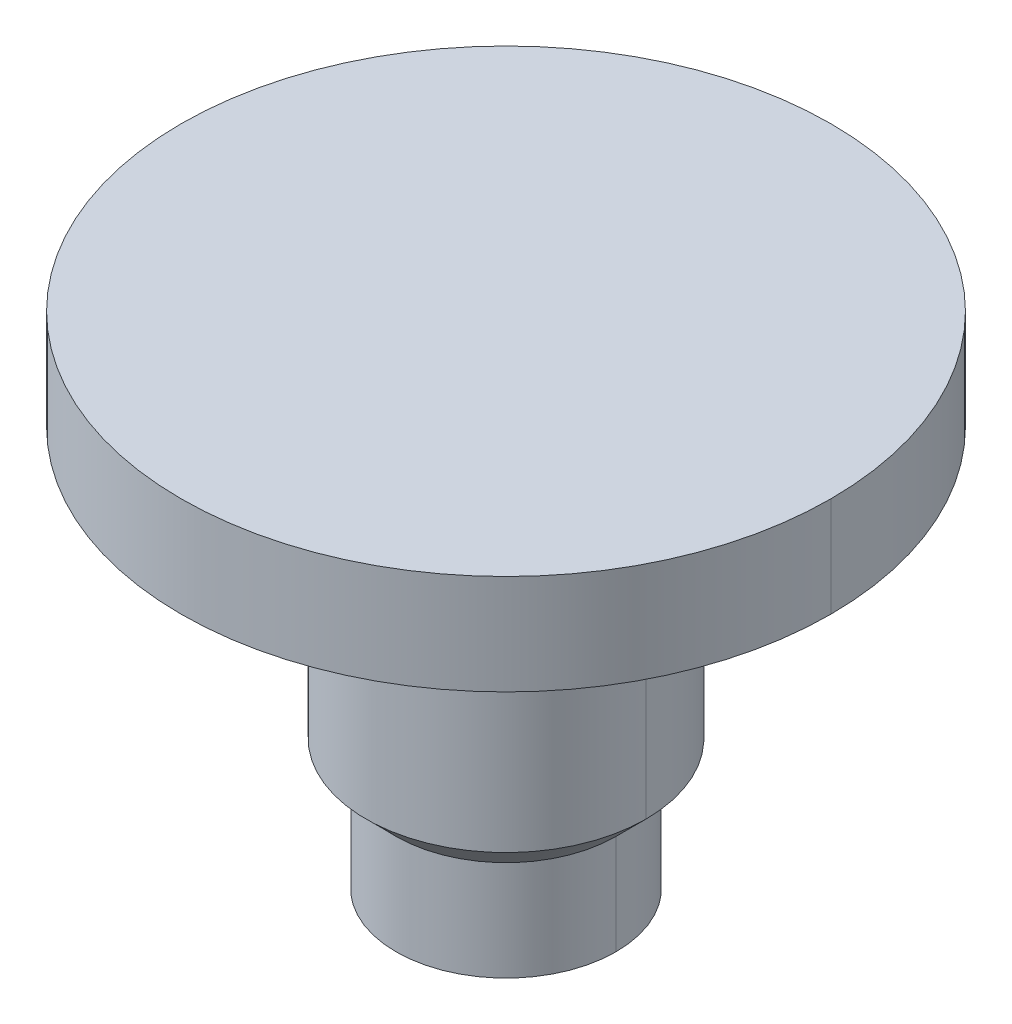
ISO-10303-21;
HEADER;
FILE_DESCRIPTION(('STEP AP214'),'2;1');
FILE_NAME('part.step','',(''),(''),'','','');
FILE_SCHEMA(('AUTOMOTIVE_DESIGN { 1 0 10303 214 1 1 1 1 }'));
ENDSEC;
DATA;
#1=APPLICATION_CONTEXT('core data for automotive mechanical design processes');
#2=APPLICATION_PROTOCOL_DEFINITION('international standard','automotive_design',2000,#1);
#3=PRODUCT_CONTEXT('',#1,'mechanical');
#4=PRODUCT('Part','Part','',(#3));
#5=PRODUCT_RELATED_PRODUCT_CATEGORY('part','',(#4));
#6=PRODUCT_DEFINITION_FORMATION('','',#4);
#7=PRODUCT_DEFINITION_CONTEXT('part definition',#1,'design');
#8=PRODUCT_DEFINITION('design','',#6,#7);
#9=PRODUCT_DEFINITION_SHAPE('','',#8);
#10=(LENGTH_UNIT() NAMED_UNIT(*) SI_UNIT(.MILLI.,.METRE.));
#11=(NAMED_UNIT(*) PLANE_ANGLE_UNIT() SI_UNIT($,.RADIAN.));
#12=(NAMED_UNIT(*) SI_UNIT($,.STERADIAN.) SOLID_ANGLE_UNIT());
#13=UNCERTAINTY_MEASURE_WITH_UNIT(LENGTH_MEASURE(1.E-05),#10,'distance_accuracy_value','');
#14=(GEOMETRIC_REPRESENTATION_CONTEXT(3) GLOBAL_UNCERTAINTY_ASSIGNED_CONTEXT((#13)) GLOBAL_UNIT_ASSIGNED_CONTEXT((#10,
#11,#12)) REPRESENTATION_CONTEXT('',''));
#15=CARTESIAN_POINT('',(0.,0.,0.));
#16=DIRECTION('',(0.,0.,1.));
#17=DIRECTION('',(1.,0.,0.));
#18=AXIS2_PLACEMENT_3D('',#15,#16,#17);
#19=CARTESIAN_POINT('',(0.,0.,0.));
#20=DIRECTION('',(0.,1.,0.));
#21=DIRECTION('',(0.,0.,1.));
#22=AXIS2_PLACEMENT_3D('',#19,#20,#21);
#23=PLANE('',#22);
#24=CARTESIAN_POINT('',(0.,0.,0.));
#25=DIRECTION('',(0.,-1.,0.));
#26=DIRECTION('',(0.,0.,-1.));
#27=AXIS2_PLACEMENT_3D('',#24,#25,#26);
#28=CIRCLE('',#27,1.1);
#29=CARTESIAN_POINT('',(-1.1,0.,0.));
#30=VERTEX_POINT('',#29);
#31=CARTESIAN_POINT('',(1.1,0.,0.));
#32=VERTEX_POINT('',#31);
#33=EDGE_CURVE('E121',#30,#32,#28,.F.);
#34=ORIENTED_EDGE('',*,*,#33,.F.);
#35=CARTESIAN_POINT('',(0.,0.,0.));
#36=DIRECTION('',(0.,-1.,0.));
#37=DIRECTION('',(0.,0.,-1.));
#38=AXIS2_PLACEMENT_3D('',#35,#36,#37);
#39=CIRCLE('',#38,1.1);
#40=EDGE_CURVE('E20',#32,#30,#39,.F.);
#41=ORIENTED_EDGE('',*,*,#40,.F.);
#42=EDGE_LOOP('',(#34,#41));
#43=FACE_BOUND('',#42,.T.);
#44=ADVANCED_FACE('F17',(#43),#23,.F.);
#45=CARTESIAN_POINT('',(0.,0.,0.));
#46=DIRECTION('',(0.,-1.,0.));
#47=DIRECTION('',(0.,0.,-1.));
#48=AXIS2_PLACEMENT_3D('',#45,#46,#47);
#49=CYLINDRICAL_SURFACE('',#48,1.1);
#50=DIRECTION('',(0.,-1.,0.));
#51=VECTOR('',#50,1.);
#52=CARTESIAN_POINT('',(1.1,0.,0.));
#53=LINE('',#52,#51);
#54=CARTESIAN_POINT('',(1.09999999999186,0.999999999995301,0.));
#55=VERTEX_POINT('',#54);
#56=EDGE_CURVE('E67',#32,#55,#53,.F.);
#57=ORIENTED_EDGE('',*,*,#56,.F.);
#58=ORIENTED_EDGE('',*,*,#40,.T.);
#59=DIRECTION('',(0.,-1.,0.));
#60=VECTOR('',#59,1.);
#61=CARTESIAN_POINT('',(-1.1,0.,0.));
#62=LINE('',#61,#60);
#63=CARTESIAN_POINT('',(-1.09999999999186,0.999999999976353,0.));
#64=VERTEX_POINT('',#63);
#65=EDGE_CURVE('E124',#64,#30,#62,.T.);
#66=ORIENTED_EDGE('',*,*,#65,.F.);
#67=CARTESIAN_POINT('',(0.,1.0000000000332,0.));
#68=DIRECTION('',(0.,1.,0.));
#69=DIRECTION('',(-1.,0.,0.));
#70=AXIS2_PLACEMENT_3D('',#67,#68,#69);
#71=CIRCLE('',#70,1.10000000000809);
#72=EDGE_CURVE('E103',#55,#64,#71,.T.);
#73=ORIENTED_EDGE('',*,*,#72,.F.);
#74=EDGE_LOOP('',(#57,#58,#66,#73));
#75=FACE_BOUND('',#74,.T.);
#76=ADVANCED_FACE('F142',(#75),#49,.T.);
#77=CARTESIAN_POINT('',(0.,0.,0.));
#78=DIRECTION('',(0.,-1.,0.));
#79=DIRECTION('',(0.,0.,-1.));
#80=AXIS2_PLACEMENT_3D('',#77,#78,#79);
#81=CYLINDRICAL_SURFACE('',#80,1.1);
#82=ORIENTED_EDGE('',*,*,#65,.T.);
#83=ORIENTED_EDGE('',*,*,#33,.T.);
#84=ORIENTED_EDGE('',*,*,#56,.T.);
#85=CARTESIAN_POINT('',(0.,1.0000000000332,0.));
#86=DIRECTION('',(0.,1.,0.));
#87=DIRECTION('',(-1.,0.,0.));
#88=AXIS2_PLACEMENT_3D('',#85,#86,#87);
#89=CIRCLE('',#88,1.10000000000809);
#90=EDGE_CURVE('E91',#64,#55,#89,.T.);
#91=ORIENTED_EDGE('',*,*,#90,.F.);
#92=EDGE_LOOP('',(#82,#83,#84,#91));
#93=FACE_BOUND('',#92,.T.);
#94=ADVANCED_FACE('F141',(#93),#81,.T.);
#95=CARTESIAN_POINT('',(0.,1.29999999990105,0.));
#96=DIRECTION('',(0.,1.,0.));
#97=DIRECTION('',(0.,0.,1.));
#98=AXIS2_PLACEMENT_3D('',#95,#96,#97);
#99=CONICAL_SURFACE('',#98,1.39999999987594,0.78539816330271);
#100=DIRECTION('',(-0.707106781186443,-0.707106781186652,0.));
#101=VECTOR('',#100,1.);
#102=CARTESIAN_POINT('',(499000.,498999.900000148,6.11078570557366E-11));
#103=LINE('',#102,#101);
#104=CARTESIAN_POINT('',(1.39999999996899,1.29999999997526,0.));
#105=VERTEX_POINT('',#104);
#106=EDGE_CURVE('E106',#55,#105,#103,.F.);
#107=ORIENTED_EDGE('',*,*,#106,.F.);
#108=ORIENTED_EDGE('',*,*,#72,.T.);
#109=DIRECTION('',(0.707106781186443,-0.707106781186652,0.));
#110=VECTOR('',#109,1.);
#111=CARTESIAN_POINT('',(-499000.,498999.900000148,0.));
#112=LINE('',#111,#110);
#113=CARTESIAN_POINT('',(-1.39999999996899,1.29999999997526,0.));
#114=VERTEX_POINT('',#113);
#115=EDGE_CURVE('E101',#114,#64,#112,.T.);
#116=ORIENTED_EDGE('',*,*,#115,.F.);
#117=CARTESIAN_POINT('',(0.,1.3,0.));
#118=DIRECTION('',(0.,-1.,0.));
#119=DIRECTION('',(0.,0.,-1.));
#120=AXIS2_PLACEMENT_3D('',#117,#118,#119);
#121=CIRCLE('',#120,1.4);
#122=EDGE_CURVE('E80',#105,#114,#121,.F.);
#123=ORIENTED_EDGE('',*,*,#122,.F.);
#124=EDGE_LOOP('',(#107,#108,#116,#123));
#125=FACE_BOUND('',#124,.T.);
#126=ADVANCED_FACE('F102',(#125),#99,.T.);
#127=CARTESIAN_POINT('',(0.,1.29999999990105,0.));
#128=DIRECTION('',(0.,1.,0.));
#129=DIRECTION('',(0.,0.,1.));
#130=AXIS2_PLACEMENT_3D('',#127,#128,#129);
#131=CONICAL_SURFACE('',#130,1.39999999987594,0.78539816330271);
#132=ORIENTED_EDGE('',*,*,#115,.T.);
#133=ORIENTED_EDGE('',*,*,#90,.T.);
#134=ORIENTED_EDGE('',*,*,#106,.T.);
#135=CARTESIAN_POINT('',(0.,1.3,0.));
#136=DIRECTION('',(0.,-1.,0.));
#137=DIRECTION('',(0.,0.,-1.));
#138=AXIS2_PLACEMENT_3D('',#135,#136,#137);
#139=CIRCLE('',#138,1.4);
#140=EDGE_CURVE('E96',#114,#105,#139,.F.);
#141=ORIENTED_EDGE('',*,*,#140,.F.);
#142=EDGE_LOOP('',(#132,#133,#134,#141));
#143=FACE_BOUND('',#142,.T.);
#144=ADVANCED_FACE('F108',(#143),#131,.T.);
#145=CARTESIAN_POINT('',(0.,0.,0.));
#146=DIRECTION('',(0.,-1.,0.));
#147=DIRECTION('',(0.,0.,-1.));
#148=AXIS2_PLACEMENT_3D('',#145,#146,#147);
#149=CYLINDRICAL_SURFACE('',#148,1.4);
#150=DIRECTION('',(0.,-1.,0.));
#151=VECTOR('',#150,1.);
#152=CARTESIAN_POINT('',(1.4,0.,0.));
#153=LINE('',#152,#151);
#154=CARTESIAN_POINT('',(1.4,4.,0.));
#155=VERTEX_POINT('',#154);
#156=EDGE_CURVE('E86',#105,#155,#153,.F.);
#157=ORIENTED_EDGE('',*,*,#156,.F.);
#158=ORIENTED_EDGE('',*,*,#122,.T.);
#159=DIRECTION('',(0.,-1.,0.));
#160=VECTOR('',#159,1.);
#161=CARTESIAN_POINT('',(-1.4,0.,0.));
#162=LINE('',#161,#160);
#163=CARTESIAN_POINT('',(-1.4,4.,0.));
#164=VERTEX_POINT('',#163);
#165=EDGE_CURVE('E84',#164,#114,#162,.T.);
#166=ORIENTED_EDGE('',*,*,#165,.F.);
#167=CARTESIAN_POINT('',(0.,4.,0.));
#168=DIRECTION('',(0.,-1.,0.));
#169=DIRECTION('',(0.,0.,-1.));
#170=AXIS2_PLACEMENT_3D('',#167,#168,#169);
#171=CIRCLE('',#170,1.4);
#172=EDGE_CURVE('E109',#164,#155,#171,.T.);
#173=ORIENTED_EDGE('',*,*,#172,.T.);
#174=EDGE_LOOP('',(#157,#158,#166,#173));
#175=FACE_BOUND('',#174,.T.);
#176=ADVANCED_FACE('F82',(#175),#149,.T.);
#177=CARTESIAN_POINT('',(0.,0.,0.));
#178=DIRECTION('',(0.,-1.,0.));
#179=DIRECTION('',(0.,0.,-1.));
#180=AXIS2_PLACEMENT_3D('',#177,#178,#179);
#181=CYLINDRICAL_SURFACE('',#180,1.4);
#182=ORIENTED_EDGE('',*,*,#165,.T.);
#183=ORIENTED_EDGE('',*,*,#140,.T.);
#184=ORIENTED_EDGE('',*,*,#156,.T.);
#185=CARTESIAN_POINT('',(0.,4.,0.));
#186=DIRECTION('',(0.,-1.,0.));
#187=DIRECTION('',(0.,0.,-1.));
#188=AXIS2_PLACEMENT_3D('',#185,#186,#187);
#189=CIRCLE('',#188,1.4);
#190=EDGE_CURVE('E98',#155,#164,#189,.T.);
#191=ORIENTED_EDGE('',*,*,#190,.T.);
#192=EDGE_LOOP('',(#182,#183,#184,#191));
#193=FACE_BOUND('',#192,.T.);
#194=ADVANCED_FACE('F94',(#193),#181,.T.);
#195=CARTESIAN_POINT('',(-1.4,4.,0.));
#196=DIRECTION('',(0.,1.,0.));
#197=DIRECTION('',(0.,0.,1.));
#198=AXIS2_PLACEMENT_3D('',#195,#196,#197);
#199=PLANE('',#198);
#200=ORIENTED_EDGE('',*,*,#172,.F.);
#201=ORIENTED_EDGE('',*,*,#190,.F.);
#202=EDGE_LOOP('',(#200,#201));
#203=FACE_BOUND('',#202,.T.);
#204=CARTESIAN_POINT('',(0.,4.,0.));
#205=DIRECTION('',(0.,-1.,0.));
#206=DIRECTION('',(0.,0.,-1.));
#207=AXIS2_PLACEMENT_3D('',#204,#205,#206);
#208=CIRCLE('',#207,3.25);
#209=CARTESIAN_POINT('',(-3.25,4.,0.));
#210=VERTEX_POINT('',#209);
#211=CARTESIAN_POINT('',(3.25,4.,0.));
#212=VERTEX_POINT('',#211);
#213=EDGE_CURVE('E136',#210,#212,#208,.F.);
#214=ORIENTED_EDGE('',*,*,#213,.F.);
#215=CARTESIAN_POINT('',(0.,4.,0.));
#216=DIRECTION('',(0.,-1.,0.));
#217=DIRECTION('',(0.,0.,-1.));
#218=AXIS2_PLACEMENT_3D('',#215,#216,#217);
#219=CIRCLE('',#218,3.25);
#220=EDGE_CURVE('E139',#212,#210,#219,.F.);
#221=ORIENTED_EDGE('',*,*,#220,.F.);
#222=EDGE_LOOP('',(#214,#221));
#223=FACE_BOUND('',#222,.T.);
#224=ADVANCED_FACE('F163',(#203,#223),#199,.F.);
#225=CARTESIAN_POINT('',(0.,0.,0.));
#226=DIRECTION('',(0.,-1.,0.));
#227=DIRECTION('',(0.,0.,-1.));
#228=AXIS2_PLACEMENT_3D('',#225,#226,#227);
#229=CYLINDRICAL_SURFACE('',#228,3.25);
#230=DIRECTION('',(0.,-1.,0.));
#231=VECTOR('',#230,1.);
#232=CARTESIAN_POINT('',(3.25,0.,0.));
#233=LINE('',#232,#231);
#234=CARTESIAN_POINT('',(3.25,5.,0.));
#235=VERTEX_POINT('',#234);
#236=EDGE_CURVE('E34',#212,#235,#233,.F.);
#237=ORIENTED_EDGE('',*,*,#236,.F.);
#238=ORIENTED_EDGE('',*,*,#220,.T.);
#239=DIRECTION('',(0.,-1.,0.));
#240=VECTOR('',#239,1.);
#241=CARTESIAN_POINT('',(-3.25,0.,0.));
#242=LINE('',#241,#240);
#243=CARTESIAN_POINT('',(-3.25,5.,0.));
#244=VERTEX_POINT('',#243);
#245=EDGE_CURVE('E138',#244,#210,#242,.T.);
#246=ORIENTED_EDGE('',*,*,#245,.F.);
#247=CARTESIAN_POINT('',(0.,5.,0.));
#248=DIRECTION('',(0.,-1.,0.));
#249=DIRECTION('',(0.,0.,-1.));
#250=AXIS2_PLACEMENT_3D('',#247,#248,#249);
#251=CIRCLE('',#250,3.25);
#252=EDGE_CURVE('E26',#244,#235,#251,.T.);
#253=ORIENTED_EDGE('',*,*,#252,.T.);
#254=EDGE_LOOP('',(#237,#238,#246,#253));
#255=FACE_BOUND('',#254,.T.);
#256=ADVANCED_FACE('F158',(#255),#229,.T.);
#257=CARTESIAN_POINT('',(0.,0.,0.));
#258=DIRECTION('',(0.,-1.,0.));
#259=DIRECTION('',(0.,0.,-1.));
#260=AXIS2_PLACEMENT_3D('',#257,#258,#259);
#261=CYLINDRICAL_SURFACE('',#260,3.25);
#262=ORIENTED_EDGE('',*,*,#245,.T.);
#263=ORIENTED_EDGE('',*,*,#213,.T.);
#264=ORIENTED_EDGE('',*,*,#236,.T.);
#265=CARTESIAN_POINT('',(0.,5.,0.));
#266=DIRECTION('',(0.,-1.,0.));
#267=DIRECTION('',(0.,0.,-1.));
#268=AXIS2_PLACEMENT_3D('',#265,#266,#267);
#269=CIRCLE('',#268,3.25);
#270=EDGE_CURVE('E11',#235,#244,#269,.T.);
#271=ORIENTED_EDGE('',*,*,#270,.T.);
#272=EDGE_LOOP('',(#262,#263,#264,#271));
#273=FACE_BOUND('',#272,.T.);
#274=ADVANCED_FACE('F152',(#273),#261,.T.);
#275=CARTESIAN_POINT('',(-3.25,5.,0.));
#276=DIRECTION('',(0.,-1.,0.));
#277=DIRECTION('',(0.,0.,-1.));
#278=AXIS2_PLACEMENT_3D('',#275,#276,#277);
#279=PLANE('',#278);
#280=ORIENTED_EDGE('',*,*,#252,.F.);
#281=ORIENTED_EDGE('',*,*,#270,.F.);
#282=EDGE_LOOP('',(#280,#281));
#283=FACE_BOUND('',#282,.T.);
#284=ADVANCED_FACE('F150',(#283),#279,.F.);
#285=CLOSED_SHELL('',(#44,#76,#94,#126,#144,#176,#194,#224,#256,#274,#284));
#286=MANIFOLD_SOLID_BREP('B1',#285);
#287=ADVANCED_BREP_SHAPE_REPRESENTATION('',(#18,#286),#14);
#288=SHAPE_DEFINITION_REPRESENTATION(#9,#287);
ENDSEC;
END-ISO-10303-21;
